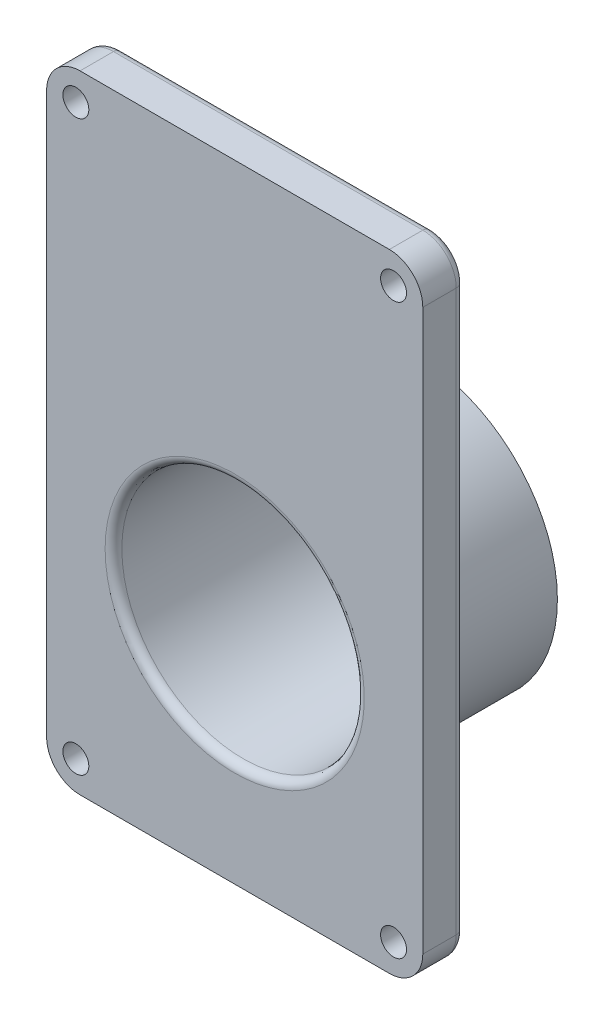
ISO-10303-21;
HEADER;
FILE_DESCRIPTION(('STEP AP214'),'2;1');
FILE_NAME('part.step','',(''),(''),'','','');
FILE_SCHEMA(('AUTOMOTIVE_DESIGN { 1 0 10303 214 1 1 1 1 }'));
ENDSEC;
DATA;
#1=APPLICATION_CONTEXT('core data for automotive mechanical design processes');
#2=APPLICATION_PROTOCOL_DEFINITION('international standard','automotive_design',2000,#1);
#3=PRODUCT_CONTEXT('',#1,'mechanical');
#4=PRODUCT('Part','Part','',(#3));
#5=PRODUCT_RELATED_PRODUCT_CATEGORY('part','',(#4));
#6=PRODUCT_DEFINITION_FORMATION('','',#4);
#7=PRODUCT_DEFINITION_CONTEXT('part definition',#1,'design');
#8=PRODUCT_DEFINITION('design','',#6,#7);
#9=PRODUCT_DEFINITION_SHAPE('','',#8);
#10=(LENGTH_UNIT() NAMED_UNIT(*) SI_UNIT(.MILLI.,.METRE.));
#11=(NAMED_UNIT(*) PLANE_ANGLE_UNIT() SI_UNIT($,.RADIAN.));
#12=(NAMED_UNIT(*) SI_UNIT($,.STERADIAN.) SOLID_ANGLE_UNIT());
#13=UNCERTAINTY_MEASURE_WITH_UNIT(LENGTH_MEASURE(1.E-05),#10,'distance_accuracy_value','');
#14=(GEOMETRIC_REPRESENTATION_CONTEXT(3) GLOBAL_UNCERTAINTY_ASSIGNED_CONTEXT((#13)) GLOBAL_UNIT_ASSIGNED_CONTEXT((#10,
#11,#12)) REPRESENTATION_CONTEXT('',''));
#15=CARTESIAN_POINT('',(0.,0.,0.));
#16=DIRECTION('',(0.,0.,1.));
#17=DIRECTION('',(1.,0.,0.));
#18=AXIS2_PLACEMENT_3D('',#15,#16,#17);
#19=CARTESIAN_POINT('',(0.,0.,5.));
#20=DIRECTION('',(0.,0.,-1.));
#21=DIRECTION('',(-1.,0.,0.));
#22=AXIS2_PLACEMENT_3D('',#19,#20,#21);
#23=PLANE('',#22);
#24=CARTESIAN_POINT('',(0.,-10.5,5.));
#25=DIRECTION('',(0.,0.,-1.));
#26=DIRECTION('',(-1.,0.,0.));
#27=AXIS2_PLACEMENT_3D('',#24,#25,#26);
#28=CIRCLE('',#27,15.5);
#29=CARTESIAN_POINT('',(-15.5,-10.5,5.));
#30=VERTEX_POINT('',#29);
#31=EDGE_CURVE('E46',#30,#30,#28,.T.);
#32=ORIENTED_EDGE('',*,*,#31,.T.);
#33=EDGE_LOOP('',(#32));
#34=FACE_BOUND('',#33,.T.);
#35=CARTESIAN_POINT('',(19.,-34.,5.));
#36=DIRECTION('',(0.,0.,-1.));
#37=DIRECTION('',(-1.,0.,0.));
#38=AXIS2_PLACEMENT_3D('',#35,#36,#37);
#39=CIRCLE('',#38,1.55);
#40=CARTESIAN_POINT('',(17.45,-34.,5.));
#41=VERTEX_POINT('',#40);
#42=EDGE_CURVE('E257',#41,#41,#39,.T.);
#43=ORIENTED_EDGE('',*,*,#42,.T.);
#44=EDGE_LOOP('',(#43));
#45=FACE_BOUND('',#44,.T.);
#46=CARTESIAN_POINT('',(-19.,-34.,5.));
#47=DIRECTION('',(0.,0.,-1.));
#48=DIRECTION('',(-1.,0.,0.));
#49=AXIS2_PLACEMENT_3D('',#46,#47,#48);
#50=CIRCLE('',#49,1.55);
#51=CARTESIAN_POINT('',(-20.55,-34.,5.));
#52=VERTEX_POINT('',#51);
#53=EDGE_CURVE('E253',#52,#52,#50,.F.);
#54=ORIENTED_EDGE('',*,*,#53,.F.);
#55=EDGE_LOOP('',(#54));
#56=FACE_BOUND('',#55,.T.);
#57=DIRECTION('',(0.,-1.,0.));
#58=VECTOR('',#57,1.);
#59=CARTESIAN_POINT('',(-22.5,37.5,5.));
#60=LINE('',#59,#58);
#61=CARTESIAN_POINT('',(-22.5,33.5,5.));
#62=VERTEX_POINT('',#61);
#63=CARTESIAN_POINT('',(-22.5,-33.5,5.));
#64=VERTEX_POINT('',#63);
#65=EDGE_CURVE('E137',#62,#64,#60,.T.);
#66=ORIENTED_EDGE('',*,*,#65,.T.);
#67=CARTESIAN_POINT('',(-18.5,-33.5,5.));
#68=DIRECTION('',(0.,0.,-1.));
#69=DIRECTION('',(-1.,0.,0.));
#70=AXIS2_PLACEMENT_3D('',#67,#68,#69);
#71=CIRCLE('',#70,4.);
#72=CARTESIAN_POINT('',(-18.5,-37.5,5.));
#73=VERTEX_POINT('',#72);
#74=EDGE_CURVE('E131',#64,#73,#71,.F.);
#75=ORIENTED_EDGE('',*,*,#74,.T.);
#76=DIRECTION('',(1.,0.,0.));
#77=VECTOR('',#76,1.);
#78=CARTESIAN_POINT('',(-22.5,-37.5,5.));
#79=LINE('',#78,#77);
#80=CARTESIAN_POINT('',(18.5,-37.5,5.));
#81=VERTEX_POINT('',#80);
#82=EDGE_CURVE('E134',#73,#81,#79,.T.);
#83=ORIENTED_EDGE('',*,*,#82,.T.);
#84=CARTESIAN_POINT('',(18.5,-33.5,5.));
#85=DIRECTION('',(0.,0.,-1.));
#86=DIRECTION('',(-1.,0.,0.));
#87=AXIS2_PLACEMENT_3D('',#84,#85,#86);
#88=CIRCLE('',#87,4.);
#89=CARTESIAN_POINT('',(22.5,-33.5,5.));
#90=VERTEX_POINT('',#89);
#91=EDGE_CURVE('E142',#81,#90,#88,.F.);
#92=ORIENTED_EDGE('',*,*,#91,.T.);
#93=DIRECTION('',(0.,-1.,0.));
#94=VECTOR('',#93,1.);
#95=CARTESIAN_POINT('',(22.5,37.5,5.));
#96=LINE('',#95,#94);
#97=CARTESIAN_POINT('',(22.5,33.5,5.));
#98=VERTEX_POINT('',#97);
#99=EDGE_CURVE('E148',#98,#90,#96,.T.);
#100=ORIENTED_EDGE('',*,*,#99,.F.);
#101=CARTESIAN_POINT('',(18.5,33.5,5.));
#102=DIRECTION('',(0.,0.,-1.));
#103=DIRECTION('',(-1.,0.,0.));
#104=AXIS2_PLACEMENT_3D('',#101,#102,#103);
#105=CIRCLE('',#104,4.);
#106=CARTESIAN_POINT('',(18.5,37.5,5.));
#107=VERTEX_POINT('',#106);
#108=EDGE_CURVE('E165',#98,#107,#105,.F.);
#109=ORIENTED_EDGE('',*,*,#108,.T.);
#110=DIRECTION('',(1.,0.,0.));
#111=VECTOR('',#110,1.);
#112=CARTESIAN_POINT('',(-22.5,37.5,5.));
#113=LINE('',#112,#111);
#114=CARTESIAN_POINT('',(-18.5,37.5,5.));
#115=VERTEX_POINT('',#114);
#116=EDGE_CURVE('E265',#115,#107,#113,.T.);
#117=ORIENTED_EDGE('',*,*,#116,.F.);
#118=CARTESIAN_POINT('',(-18.5,33.5,5.));
#119=DIRECTION('',(0.,0.,-1.));
#120=DIRECTION('',(-1.,0.,0.));
#121=AXIS2_PLACEMENT_3D('',#118,#119,#120);
#122=CIRCLE('',#121,4.);
#123=EDGE_CURVE('E163',#115,#62,#122,.F.);
#124=ORIENTED_EDGE('',*,*,#123,.T.);
#125=EDGE_LOOP('',(#66,#75,#83,#92,#100,#109,#117,#124));
#126=FACE_BOUND('',#125,.T.);
#127=CARTESIAN_POINT('',(19.,34.,5.));
#128=DIRECTION('',(0.,0.,-1.));
#129=DIRECTION('',(-1.,0.,0.));
#130=AXIS2_PLACEMENT_3D('',#127,#128,#129);
#131=CIRCLE('',#130,1.55);
#132=CARTESIAN_POINT('',(17.45,34.,5.));
#133=VERTEX_POINT('',#132);
#134=EDGE_CURVE('E249',#133,#133,#131,.F.);
#135=ORIENTED_EDGE('',*,*,#134,.F.);
#136=EDGE_LOOP('',(#135));
#137=FACE_BOUND('',#136,.T.);
#138=CARTESIAN_POINT('',(-19.,34.,5.));
#139=DIRECTION('',(0.,0.,-1.));
#140=DIRECTION('',(-1.,0.,0.));
#141=AXIS2_PLACEMENT_3D('',#138,#139,#140);
#142=CIRCLE('',#141,1.55);
#143=CARTESIAN_POINT('',(-20.55,34.,5.));
#144=VERTEX_POINT('',#143);
#145=EDGE_CURVE('E149',#144,#144,#142,.T.);
#146=ORIENTED_EDGE('',*,*,#145,.T.);
#147=EDGE_LOOP('',(#146));
#148=FACE_BOUND('',#147,.T.);
#149=ADVANCED_FACE('F37',(#34,#45,#56,#126,#137,#148),#23,.F.);
#150=CARTESIAN_POINT('',(0.,0.,0.));
#151=DIRECTION('',(0.,0.,-1.));
#152=DIRECTION('',(-1.,0.,0.));
#153=AXIS2_PLACEMENT_3D('',#150,#151,#152);
#154=PLANE('',#153);
#155=DIRECTION('',(1.,0.,0.));
#156=VECTOR('',#155,1.);
#157=CARTESIAN_POINT('',(0.,36.5,0.));
#158=LINE('',#157,#156);
#159=CARTESIAN_POINT('',(-18.5,36.5,0.));
#160=VERTEX_POINT('',#159);
#161=CARTESIAN_POINT('',(18.5,36.5,0.));
#162=VERTEX_POINT('',#161);
#163=EDGE_CURVE('E194',#160,#162,#158,.T.);
#164=ORIENTED_EDGE('',*,*,#163,.T.);
#165=CARTESIAN_POINT('',(18.5,33.5,0.));
#166=DIRECTION('',(0.,0.,-1.));
#167=DIRECTION('',(-1.,0.,0.));
#168=AXIS2_PLACEMENT_3D('',#165,#166,#167);
#169=CIRCLE('',#168,3.);
#170=CARTESIAN_POINT('',(21.5,33.5,0.));
#171=VERTEX_POINT('',#170);
#172=EDGE_CURVE('E196',#162,#171,#169,.T.);
#173=ORIENTED_EDGE('',*,*,#172,.T.);
#174=DIRECTION('',(0.,-1.,0.));
#175=VECTOR('',#174,1.);
#176=CARTESIAN_POINT('',(21.5,0.,0.));
#177=LINE('',#176,#175);
#178=CARTESIAN_POINT('',(21.5,-33.5,0.));
#179=VERTEX_POINT('',#178);
#180=EDGE_CURVE('E182',#171,#179,#177,.T.);
#181=ORIENTED_EDGE('',*,*,#180,.T.);
#182=CARTESIAN_POINT('',(18.5,-33.5,0.));
#183=DIRECTION('',(0.,0.,-1.));
#184=DIRECTION('',(-1.,0.,0.));
#185=AXIS2_PLACEMENT_3D('',#182,#183,#184);
#186=CIRCLE('',#185,3.);
#187=CARTESIAN_POINT('',(18.5,-36.5,0.));
#188=VERTEX_POINT('',#187);
#189=EDGE_CURVE('E184',#179,#188,#186,.T.);
#190=ORIENTED_EDGE('',*,*,#189,.T.);
#191=DIRECTION('',(1.,0.,0.));
#192=VECTOR('',#191,1.);
#193=CARTESIAN_POINT('',(-18.5,-36.5,0.));
#194=LINE('',#193,#192);
#195=CARTESIAN_POINT('',(-18.5,-36.5,0.));
#196=VERTEX_POINT('',#195);
#197=EDGE_CURVE('E186',#188,#196,#194,.F.);
#198=ORIENTED_EDGE('',*,*,#197,.T.);
#199=CARTESIAN_POINT('',(-18.5,-33.5,0.));
#200=DIRECTION('',(0.,0.,-1.));
#201=DIRECTION('',(-1.,0.,0.));
#202=AXIS2_PLACEMENT_3D('',#199,#200,#201);
#203=CIRCLE('',#202,3.);
#204=CARTESIAN_POINT('',(-21.5,-33.5,0.));
#205=VERTEX_POINT('',#204);
#206=EDGE_CURVE('E188',#196,#205,#203,.T.);
#207=ORIENTED_EDGE('',*,*,#206,.T.);
#208=DIRECTION('',(0.,-1.,0.));
#209=VECTOR('',#208,1.);
#210=CARTESIAN_POINT('',(-21.5,33.5,0.));
#211=LINE('',#210,#209);
#212=CARTESIAN_POINT('',(-21.5,33.5,0.));
#213=VERTEX_POINT('',#212);
#214=EDGE_CURVE('E190',#205,#213,#211,.F.);
#215=ORIENTED_EDGE('',*,*,#214,.T.);
#216=CARTESIAN_POINT('',(-18.5,33.5,0.));
#217=DIRECTION('',(0.,0.,-1.));
#218=DIRECTION('',(-1.,0.,0.));
#219=AXIS2_PLACEMENT_3D('',#216,#217,#218);
#220=CIRCLE('',#219,3.);
#221=EDGE_CURVE('E192',#213,#160,#220,.T.);
#222=ORIENTED_EDGE('',*,*,#221,.T.);
#223=EDGE_LOOP('',(#164,#173,#181,#190,#198,#207,#215,#222));
#224=FACE_BOUND('',#223,.T.);
#225=CARTESIAN_POINT('',(0.,-10.5,0.));
#226=DIRECTION('',(0.,0.,-1.));
#227=DIRECTION('',(-1.,0.,0.));
#228=AXIS2_PLACEMENT_3D('',#225,#226,#227);
#229=CIRCLE('',#228,18.8);
#230=CARTESIAN_POINT('',(-18.8,-10.5,0.));
#231=VERTEX_POINT('',#230);
#232=EDGE_CURVE('E179',#231,#231,#229,.F.);
#233=ORIENTED_EDGE('',*,*,#232,.T.);
#234=EDGE_LOOP('',(#233));
#235=FACE_BOUND('',#234,.T.);
#236=CARTESIAN_POINT('',(-19.,-34.,0.));
#237=DIRECTION('',(0.,0.,-1.));
#238=DIRECTION('',(-1.,0.,0.));
#239=AXIS2_PLACEMENT_3D('',#236,#237,#238);
#240=CIRCLE('',#239,1.55);
#241=CARTESIAN_POINT('',(-20.55,-34.,0.));
#242=VERTEX_POINT('',#241);
#243=EDGE_CURVE('E252',#242,#242,#240,.F.);
#244=ORIENTED_EDGE('',*,*,#243,.T.);
#245=EDGE_LOOP('',(#244));
#246=FACE_BOUND('',#245,.T.);
#247=CARTESIAN_POINT('',(19.,34.,0.));
#248=DIRECTION('',(0.,0.,-1.));
#249=DIRECTION('',(-1.,0.,0.));
#250=AXIS2_PLACEMENT_3D('',#247,#248,#249);
#251=CIRCLE('',#250,1.55);
#252=CARTESIAN_POINT('',(17.45,34.,0.));
#253=VERTEX_POINT('',#252);
#254=EDGE_CURVE('E246',#253,#253,#251,.F.);
#255=ORIENTED_EDGE('',*,*,#254,.T.);
#256=EDGE_LOOP('',(#255));
#257=FACE_BOUND('',#256,.T.);
#258=CARTESIAN_POINT('',(19.,-34.,0.));
#259=DIRECTION('',(0.,0.,-1.));
#260=DIRECTION('',(-1.,0.,0.));
#261=AXIS2_PLACEMENT_3D('',#258,#259,#260);
#262=CIRCLE('',#261,1.55);
#263=CARTESIAN_POINT('',(17.45,-34.,0.));
#264=VERTEX_POINT('',#263);
#265=EDGE_CURVE('E256',#264,#264,#262,.T.);
#266=ORIENTED_EDGE('',*,*,#265,.F.);
#267=EDGE_LOOP('',(#266));
#268=FACE_BOUND('',#267,.T.);
#269=CARTESIAN_POINT('',(-19.,34.,0.));
#270=DIRECTION('',(0.,0.,-1.));
#271=DIRECTION('',(-1.,0.,0.));
#272=AXIS2_PLACEMENT_3D('',#269,#270,#271);
#273=CIRCLE('',#272,1.55);
#274=CARTESIAN_POINT('',(-20.55,34.,0.));
#275=VERTEX_POINT('',#274);
#276=EDGE_CURVE('E260',#275,#275,#273,.T.);
#277=ORIENTED_EDGE('',*,*,#276,.F.);
#278=EDGE_LOOP('',(#277));
#279=FACE_BOUND('',#278,.T.);
#280=ADVANCED_FACE('F280',(#224,#235,#246,#257,#268,#279),#154,.T.);
#281=CARTESIAN_POINT('',(-22.5,-37.5,5.));
#282=DIRECTION('',(0.,1.,0.));
#283=DIRECTION('',(0.,0.,1.));
#284=AXIS2_PLACEMENT_3D('',#281,#282,#283);
#285=PLANE('',#284);
#286=DIRECTION('',(0.,0.,-1.));
#287=VECTOR('',#286,1.);
#288=CARTESIAN_POINT('',(-18.5,-37.5,5.));
#289=LINE('',#288,#287);
#290=CARTESIAN_POINT('',(-18.5,-37.5,1.));
#291=VERTEX_POINT('',#290);
#292=EDGE_CURVE('E145',#73,#291,#289,.T.);
#293=ORIENTED_EDGE('',*,*,#292,.T.);
#294=DIRECTION('',(1.,0.,0.));
#295=VECTOR('',#294,1.);
#296=CARTESIAN_POINT('',(18.5,-37.5,1.));
#297=LINE('',#296,#295);
#298=CARTESIAN_POINT('',(18.5,-37.5,1.));
#299=VERTEX_POINT('',#298);
#300=EDGE_CURVE('E62',#291,#299,#297,.T.);
#301=ORIENTED_EDGE('',*,*,#300,.T.);
#302=DIRECTION('',(0.,0.,-1.));
#303=VECTOR('',#302,1.);
#304=CARTESIAN_POINT('',(18.5,-37.5,5.));
#305=LINE('',#304,#303);
#306=EDGE_CURVE('E147',#299,#81,#305,.F.);
#307=ORIENTED_EDGE('',*,*,#306,.T.);
#308=ORIENTED_EDGE('',*,*,#82,.F.);
#309=EDGE_LOOP('',(#293,#301,#307,#308));
#310=FACE_BOUND('',#309,.T.);
#311=ADVANCED_FACE('F144',(#310),#285,.F.);
#312=CARTESIAN_POINT('',(22.5,37.5,5.));
#313=DIRECTION('',(1.,0.,0.));
#314=DIRECTION('',(0.,1.,0.));
#315=AXIS2_PLACEMENT_3D('',#312,#313,#314);
#316=PLANE('',#315);
#317=DIRECTION('',(0.,0.,-1.));
#318=VECTOR('',#317,1.);
#319=CARTESIAN_POINT('',(22.5,-33.5,0.));
#320=LINE('',#319,#318);
#321=CARTESIAN_POINT('',(22.5,-33.5,1.));
#322=VERTEX_POINT('',#321);
#323=EDGE_CURVE('E169',#90,#322,#320,.T.);
#324=ORIENTED_EDGE('',*,*,#323,.T.);
#325=DIRECTION('',(0.,-1.,0.));
#326=VECTOR('',#325,1.);
#327=CARTESIAN_POINT('',(22.5,37.5,1.));
#328=LINE('',#327,#326);
#329=CARTESIAN_POINT('',(22.5,33.5,1.));
#330=VERTEX_POINT('',#329);
#331=EDGE_CURVE('E211',#322,#330,#328,.F.);
#332=ORIENTED_EDGE('',*,*,#331,.T.);
#333=DIRECTION('',(0.,0.,-1.));
#334=VECTOR('',#333,1.);
#335=CARTESIAN_POINT('',(22.5,33.5,5.));
#336=LINE('',#335,#334);
#337=EDGE_CURVE('E141',#330,#98,#336,.F.);
#338=ORIENTED_EDGE('',*,*,#337,.T.);
#339=ORIENTED_EDGE('',*,*,#99,.T.);
#340=EDGE_LOOP('',(#324,#332,#338,#339));
#341=FACE_BOUND('',#340,.T.);
#342=ADVANCED_FACE('F288',(#341),#316,.T.);
#343=CARTESIAN_POINT('',(-22.5,37.5,5.));
#344=DIRECTION('',(0.,1.,0.));
#345=DIRECTION('',(0.,0.,1.));
#346=AXIS2_PLACEMENT_3D('',#343,#344,#345);
#347=PLANE('',#346);
#348=DIRECTION('',(0.,0.,-1.));
#349=VECTOR('',#348,1.);
#350=CARTESIAN_POINT('',(18.5,37.5,5.));
#351=LINE('',#350,#349);
#352=CARTESIAN_POINT('',(18.5,37.5,1.));
#353=VERTEX_POINT('',#352);
#354=EDGE_CURVE('E173',#107,#353,#351,.T.);
#355=ORIENTED_EDGE('',*,*,#354,.T.);
#356=DIRECTION('',(1.,0.,0.));
#357=VECTOR('',#356,1.);
#358=CARTESIAN_POINT('',(-22.5,37.5,1.));
#359=LINE('',#358,#357);
#360=CARTESIAN_POINT('',(-18.5,37.5,1.));
#361=VERTEX_POINT('',#360);
#362=EDGE_CURVE('E202',#353,#361,#359,.F.);
#363=ORIENTED_EDGE('',*,*,#362,.T.);
#364=DIRECTION('',(0.,0.,-1.));
#365=VECTOR('',#364,1.);
#366=CARTESIAN_POINT('',(-18.5,37.5,5.));
#367=LINE('',#366,#365);
#368=EDGE_CURVE('E171',#361,#115,#367,.F.);
#369=ORIENTED_EDGE('',*,*,#368,.T.);
#370=ORIENTED_EDGE('',*,*,#116,.T.);
#371=EDGE_LOOP('',(#355,#363,#369,#370));
#372=FACE_BOUND('',#371,.T.);
#373=ADVANCED_FACE('F299',(#372),#347,.T.);
#374=CARTESIAN_POINT('',(-22.5,37.5,5.));
#375=DIRECTION('',(1.,0.,0.));
#376=DIRECTION('',(0.,1.,0.));
#377=AXIS2_PLACEMENT_3D('',#374,#375,#376);
#378=PLANE('',#377);
#379=DIRECTION('',(0.,0.,-1.));
#380=VECTOR('',#379,1.);
#381=CARTESIAN_POINT('',(-22.5,33.5,0.));
#382=LINE('',#381,#380);
#383=CARTESIAN_POINT('',(-22.5,33.5,1.));
#384=VERTEX_POINT('',#383);
#385=EDGE_CURVE('E154',#62,#384,#382,.T.);
#386=ORIENTED_EDGE('',*,*,#385,.T.);
#387=DIRECTION('',(0.,-1.,0.));
#388=VECTOR('',#387,1.);
#389=CARTESIAN_POINT('',(-22.5,-33.5,1.));
#390=LINE('',#389,#388);
#391=CARTESIAN_POINT('',(-22.5,-33.5,1.));
#392=VERTEX_POINT('',#391);
#393=EDGE_CURVE('E206',#384,#392,#390,.T.);
#394=ORIENTED_EDGE('',*,*,#393,.T.);
#395=DIRECTION('',(0.,0.,-1.));
#396=VECTOR('',#395,1.);
#397=CARTESIAN_POINT('',(-22.5,-33.5,5.));
#398=LINE('',#397,#396);
#399=EDGE_CURVE('E157',#392,#64,#398,.F.);
#400=ORIENTED_EDGE('',*,*,#399,.T.);
#401=ORIENTED_EDGE('',*,*,#65,.F.);
#402=EDGE_LOOP('',(#386,#394,#400,#401));
#403=FACE_BOUND('',#402,.T.);
#404=ADVANCED_FACE('F295',(#403),#378,.F.);
#405=CARTESIAN_POINT('',(19.,34.,-22.5));
#406=DIRECTION('',(0.,0.,1.));
#407=DIRECTION('',(1.,0.,0.));
#408=AXIS2_PLACEMENT_3D('',#405,#406,#407);
#409=CYLINDRICAL_SURFACE('',#408,1.55);
#410=ORIENTED_EDGE('',*,*,#254,.F.);
#411=EDGE_LOOP('',(#410));
#412=FACE_BOUND('',#411,.T.);
#413=ORIENTED_EDGE('',*,*,#134,.T.);
#414=EDGE_LOOP('',(#413));
#415=FACE_BOUND('',#414,.T.);
#416=ADVANCED_FACE('F298',(#412,#415),#409,.F.);
#417=CARTESIAN_POINT('',(0.,-10.5,-22.5));
#418=DIRECTION('',(0.,0.,1.));
#419=DIRECTION('',(1.,0.,0.));
#420=AXIS2_PLACEMENT_3D('',#417,#418,#419);
#421=CYLINDRICAL_SURFACE('',#420,14.5);
#422=CARTESIAN_POINT('',(0.,-10.5,4.));
#423=DIRECTION('',(0.,0.,-1.));
#424=DIRECTION('',(-1.,0.,0.));
#425=AXIS2_PLACEMENT_3D('',#422,#423,#424);
#426=CIRCLE('',#425,14.5);
#427=CARTESIAN_POINT('',(-14.5,-10.5,4.));
#428=VERTEX_POINT('',#427);
#429=EDGE_CURVE('E11',#428,#428,#426,.F.);
#430=ORIENTED_EDGE('',*,*,#429,.T.);
#431=EDGE_LOOP('',(#430));
#432=FACE_BOUND('',#431,.T.);
#433=CARTESIAN_POINT('',(0.,-10.5,-16.8));
#434=DIRECTION('',(0.,0.,-1.));
#435=DIRECTION('',(-1.,0.,0.));
#436=AXIS2_PLACEMENT_3D('',#433,#434,#435);
#437=CIRCLE('',#436,14.5);
#438=CARTESIAN_POINT('',(-14.5,-10.5,-16.8));
#439=VERTEX_POINT('',#438);
#440=EDGE_CURVE('E235',#439,#439,#437,.F.);
#441=ORIENTED_EDGE('',*,*,#440,.F.);
#442=EDGE_LOOP('',(#441));
#443=FACE_BOUND('',#442,.T.);
#444=ADVANCED_FACE('F459',(#432,#443),#421,.F.);
#445=CARTESIAN_POINT('',(-19.,-34.,-22.5));
#446=DIRECTION('',(0.,0.,1.));
#447=DIRECTION('',(1.,0.,0.));
#448=AXIS2_PLACEMENT_3D('',#445,#446,#447);
#449=CYLINDRICAL_SURFACE('',#448,1.55);
#450=ORIENTED_EDGE('',*,*,#243,.F.);
#451=EDGE_LOOP('',(#450));
#452=FACE_BOUND('',#451,.T.);
#453=ORIENTED_EDGE('',*,*,#53,.T.);
#454=EDGE_LOOP('',(#453));
#455=FACE_BOUND('',#454,.T.);
#456=ADVANCED_FACE('F465',(#452,#455),#449,.F.);
#457=CARTESIAN_POINT('',(19.,-34.,-22.5));
#458=DIRECTION('',(0.,0.,1.));
#459=DIRECTION('',(1.,0.,0.));
#460=AXIS2_PLACEMENT_3D('',#457,#458,#459);
#461=CYLINDRICAL_SURFACE('',#460,1.55);
#462=ORIENTED_EDGE('',*,*,#265,.T.);
#463=EDGE_LOOP('',(#462));
#464=FACE_BOUND('',#463,.T.);
#465=ORIENTED_EDGE('',*,*,#42,.F.);
#466=EDGE_LOOP('',(#465));
#467=FACE_BOUND('',#466,.T.);
#468=ADVANCED_FACE('F508',(#464,#467),#461,.F.);
#469=CARTESIAN_POINT('',(-19.,34.,-22.5));
#470=DIRECTION('',(0.,0.,1.));
#471=DIRECTION('',(1.,0.,0.));
#472=AXIS2_PLACEMENT_3D('',#469,#470,#471);
#473=CYLINDRICAL_SURFACE('',#472,1.55);
#474=ORIENTED_EDGE('',*,*,#276,.T.);
#475=EDGE_LOOP('',(#474));
#476=FACE_BOUND('',#475,.T.);
#477=ORIENTED_EDGE('',*,*,#145,.F.);
#478=EDGE_LOOP('',(#477));
#479=FACE_BOUND('',#478,.T.);
#480=ADVANCED_FACE('F277',(#476,#479),#473,.F.);
#481=CARTESIAN_POINT('',(-18.5,-33.5,5.));
#482=DIRECTION('',(0.,0.,-1.));
#483=DIRECTION('',(-1.,0.,0.));
#484=AXIS2_PLACEMENT_3D('',#481,#482,#483);
#485=CYLINDRICAL_SURFACE('',#484,4.);
#486=ORIENTED_EDGE('',*,*,#399,.F.);
#487=CARTESIAN_POINT('',(-18.5,-33.5,1.));
#488=DIRECTION('',(0.,0.,-1.));
#489=DIRECTION('',(-1.,0.,0.));
#490=AXIS2_PLACEMENT_3D('',#487,#488,#489);
#491=CIRCLE('',#490,4.);
#492=EDGE_CURVE('E153',#392,#291,#491,.F.);
#493=ORIENTED_EDGE('',*,*,#492,.T.);
#494=ORIENTED_EDGE('',*,*,#292,.F.);
#495=ORIENTED_EDGE('',*,*,#74,.F.);
#496=EDGE_LOOP('',(#486,#493,#494,#495));
#497=FACE_BOUND('',#496,.T.);
#498=ADVANCED_FACE('F151',(#497),#485,.T.);
#499=CARTESIAN_POINT('',(18.5,-33.5,5.));
#500=DIRECTION('',(0.,0.,1.));
#501=DIRECTION('',(1.,0.,0.));
#502=AXIS2_PLACEMENT_3D('',#499,#500,#501);
#503=CYLINDRICAL_SURFACE('',#502,4.);
#504=ORIENTED_EDGE('',*,*,#306,.F.);
#505=CARTESIAN_POINT('',(18.5,-33.5,1.));
#506=DIRECTION('',(0.,0.,-1.));
#507=DIRECTION('',(-1.,0.,0.));
#508=AXIS2_PLACEMENT_3D('',#505,#506,#507);
#509=CIRCLE('',#508,4.);
#510=EDGE_CURVE('E54',#299,#322,#509,.F.);
#511=ORIENTED_EDGE('',*,*,#510,.T.);
#512=ORIENTED_EDGE('',*,*,#323,.F.);
#513=ORIENTED_EDGE('',*,*,#91,.F.);
#514=EDGE_LOOP('',(#504,#511,#512,#513));
#515=FACE_BOUND('',#514,.T.);
#516=ADVANCED_FACE('F309',(#515),#503,.T.);
#517=CARTESIAN_POINT('',(18.5,33.5,5.));
#518=DIRECTION('',(0.,0.,-1.));
#519=DIRECTION('',(-1.,0.,0.));
#520=AXIS2_PLACEMENT_3D('',#517,#518,#519);
#521=CYLINDRICAL_SURFACE('',#520,4.);
#522=ORIENTED_EDGE('',*,*,#337,.F.);
#523=CARTESIAN_POINT('',(18.5,33.5,1.));
#524=DIRECTION('',(0.,0.,-1.));
#525=DIRECTION('',(-1.,0.,0.));
#526=AXIS2_PLACEMENT_3D('',#523,#524,#525);
#527=CIRCLE('',#526,4.);
#528=EDGE_CURVE('E199',#330,#353,#527,.F.);
#529=ORIENTED_EDGE('',*,*,#528,.T.);
#530=ORIENTED_EDGE('',*,*,#354,.F.);
#531=ORIENTED_EDGE('',*,*,#108,.F.);
#532=EDGE_LOOP('',(#522,#529,#530,#531));
#533=FACE_BOUND('',#532,.T.);
#534=ADVANCED_FACE('F312',(#533),#521,.T.);
#535=CARTESIAN_POINT('',(-18.5,33.5,5.));
#536=DIRECTION('',(0.,0.,1.));
#537=DIRECTION('',(1.,0.,0.));
#538=AXIS2_PLACEMENT_3D('',#535,#536,#537);
#539=CYLINDRICAL_SURFACE('',#538,4.);
#540=ORIENTED_EDGE('',*,*,#368,.F.);
#541=CARTESIAN_POINT('',(-18.5,33.5,1.));
#542=DIRECTION('',(0.,0.,-1.));
#543=DIRECTION('',(-1.,0.,0.));
#544=AXIS2_PLACEMENT_3D('',#541,#542,#543);
#545=CIRCLE('',#544,4.);
#546=EDGE_CURVE('E204',#361,#384,#545,.F.);
#547=ORIENTED_EDGE('',*,*,#546,.T.);
#548=ORIENTED_EDGE('',*,*,#385,.F.);
#549=ORIENTED_EDGE('',*,*,#123,.F.);
#550=EDGE_LOOP('',(#540,#547,#548,#549));
#551=FACE_BOUND('',#550,.T.);
#552=ADVANCED_FACE('F315',(#551),#539,.T.);
#553=CARTESIAN_POINT('',(0.,-10.5,-16.8));
#554=DIRECTION('',(0.,0.,1.));
#555=DIRECTION('',(1.,0.,0.));
#556=AXIS2_PLACEMENT_3D('',#553,#554,#555);
#557=CYLINDRICAL_SURFACE('',#556,16.8);
#558=CARTESIAN_POINT('',(0.,-10.5,-2.));
#559=DIRECTION('',(0.,0.,-1.));
#560=DIRECTION('',(-1.,0.,0.));
#561=AXIS2_PLACEMENT_3D('',#558,#559,#560);
#562=CIRCLE('',#561,16.8);
#563=CARTESIAN_POINT('',(-16.8,-10.5,-2.));
#564=VERTEX_POINT('',#563);
#565=EDGE_CURVE('E176',#564,#564,#562,.T.);
#566=ORIENTED_EDGE('',*,*,#565,.T.);
#567=EDGE_LOOP('',(#566));
#568=FACE_BOUND('',#567,.T.);
#569=CARTESIAN_POINT('',(0.,-10.5,-16.8));
#570=DIRECTION('',(0.,0.,-1.));
#571=DIRECTION('',(-1.,0.,0.));
#572=AXIS2_PLACEMENT_3D('',#569,#570,#571);
#573=CIRCLE('',#572,16.8);
#574=CARTESIAN_POINT('',(-16.8,-10.5,-16.8));
#575=VERTEX_POINT('',#574);
#576=EDGE_CURVE('E241',#575,#575,#573,.T.);
#577=ORIENTED_EDGE('',*,*,#576,.F.);
#578=EDGE_LOOP('',(#577));
#579=FACE_BOUND('',#578,.T.);
#580=ADVANCED_FACE('F319',(#568,#579),#557,.T.);
#581=CARTESIAN_POINT('',(0.,0.,-16.8));
#582=DIRECTION('',(0.,0.,-1.));
#583=DIRECTION('',(-1.,0.,0.));
#584=AXIS2_PLACEMENT_3D('',#581,#582,#583);
#585=PLANE('',#584);
#586=ORIENTED_EDGE('',*,*,#440,.T.);
#587=EDGE_LOOP('',(#586));
#588=FACE_BOUND('',#587,.T.);
#589=ORIENTED_EDGE('',*,*,#576,.T.);
#590=EDGE_LOOP('',(#589));
#591=FACE_BOUND('',#590,.T.);
#592=ADVANCED_FACE('F325',(#588,#591),#585,.T.);
#593=CARTESIAN_POINT('',(0.,-10.5,-2.));
#594=DIRECTION('',(0.,0.,-1.));
#595=DIRECTION('',(-1.,0.,0.));
#596=AXIS2_PLACEMENT_3D('',#593,#594,#595);
#597=TOROIDAL_SURFACE('',#596,18.8,2.);
#598=ORIENTED_EDGE('',*,*,#232,.F.);
#599=EDGE_LOOP('',(#598));
#600=FACE_BOUND('',#599,.T.);
#601=ORIENTED_EDGE('',*,*,#565,.F.);
#602=EDGE_LOOP('',(#601));
#603=FACE_BOUND('',#602,.T.);
#604=ADVANCED_FACE('F321',(#600,#603),#597,.F.);
#605=CARTESIAN_POINT('',(-18.5,-33.5,1.));
#606=DIRECTION('',(0.,0.,-1.));
#607=DIRECTION('',(-1.,0.,0.));
#608=AXIS2_PLACEMENT_3D('',#605,#606,#607);
#609=TOROIDAL_SURFACE('',#608,3.,1.);
#610=CARTESIAN_POINT('',(-18.5,-36.5,1.));
#611=DIRECTION('',(1.,0.,0.));
#612=DIRECTION('',(0.,0.,-1.));
#613=AXIS2_PLACEMENT_3D('',#610,#611,#612);
#614=CIRCLE('',#613,1.);
#615=EDGE_CURVE('E230',#291,#196,#614,.T.);
#616=ORIENTED_EDGE('',*,*,#615,.F.);
#617=ORIENTED_EDGE('',*,*,#492,.F.);
#618=CARTESIAN_POINT('',(-21.5,-33.5,1.));
#619=DIRECTION('',(0.,1.,0.));
#620=DIRECTION('',(0.,0.,1.));
#621=AXIS2_PLACEMENT_3D('',#618,#619,#620);
#622=CIRCLE('',#621,1.);
#623=EDGE_CURVE('E41',#205,#392,#622,.T.);
#624=ORIENTED_EDGE('',*,*,#623,.F.);
#625=ORIENTED_EDGE('',*,*,#206,.F.);
#626=EDGE_LOOP('',(#616,#617,#624,#625));
#627=FACE_BOUND('',#626,.T.);
#628=ADVANCED_FACE('F324',(#627),#609,.T.);
#629=CARTESIAN_POINT('',(-21.5,37.5,1.));
#630=DIRECTION('',(0.,1.,0.));
#631=DIRECTION('',(-1.,0.,0.));
#632=AXIS2_PLACEMENT_3D('',#629,#630,#631);
#633=CYLINDRICAL_SURFACE('',#632,1.);
#634=ORIENTED_EDGE('',*,*,#623,.T.);
#635=ORIENTED_EDGE('',*,*,#393,.F.);
#636=CARTESIAN_POINT('',(-21.5,33.5,1.));
#637=DIRECTION('',(0.,1.,0.));
#638=DIRECTION('',(0.,0.,1.));
#639=AXIS2_PLACEMENT_3D('',#636,#637,#638);
#640=CIRCLE('',#639,1.);
#641=EDGE_CURVE('E228',#213,#384,#640,.T.);
#642=ORIENTED_EDGE('',*,*,#641,.F.);
#643=ORIENTED_EDGE('',*,*,#214,.F.);
#644=EDGE_LOOP('',(#634,#635,#642,#643));
#645=FACE_BOUND('',#644,.T.);
#646=ADVANCED_FACE('F350',(#645),#633,.T.);
#647=CARTESIAN_POINT('',(-22.5,-36.5,1.));
#648=DIRECTION('',(-1.,0.,0.));
#649=DIRECTION('',(0.,0.,1.));
#650=AXIS2_PLACEMENT_3D('',#647,#648,#649);
#651=CYLINDRICAL_SURFACE('',#650,1.);
#652=ORIENTED_EDGE('',*,*,#615,.T.);
#653=ORIENTED_EDGE('',*,*,#197,.F.);
#654=CARTESIAN_POINT('',(18.5,-36.5,1.));
#655=DIRECTION('',(1.,0.,0.));
#656=DIRECTION('',(0.,0.,-1.));
#657=AXIS2_PLACEMENT_3D('',#654,#655,#656);
#658=CIRCLE('',#657,1.);
#659=EDGE_CURVE('E225',#299,#188,#658,.T.);
#660=ORIENTED_EDGE('',*,*,#659,.F.);
#661=ORIENTED_EDGE('',*,*,#300,.F.);
#662=EDGE_LOOP('',(#652,#653,#660,#661));
#663=FACE_BOUND('',#662,.T.);
#664=ADVANCED_FACE('F346',(#663),#651,.T.);
#665=CARTESIAN_POINT('',(-18.5,33.5,1.));
#666=DIRECTION('',(0.,0.,-1.));
#667=DIRECTION('',(-1.,0.,0.));
#668=AXIS2_PLACEMENT_3D('',#665,#666,#667);
#669=TOROIDAL_SURFACE('',#668,3.,1.);
#670=ORIENTED_EDGE('',*,*,#641,.T.);
#671=ORIENTED_EDGE('',*,*,#546,.F.);
#672=CARTESIAN_POINT('',(-18.5,36.5,1.));
#673=DIRECTION('',(1.,0.,0.));
#674=DIRECTION('',(0.,0.,-1.));
#675=AXIS2_PLACEMENT_3D('',#672,#673,#674);
#676=CIRCLE('',#675,1.);
#677=EDGE_CURVE('E222',#160,#361,#676,.T.);
#678=ORIENTED_EDGE('',*,*,#677,.F.);
#679=ORIENTED_EDGE('',*,*,#221,.F.);
#680=EDGE_LOOP('',(#670,#671,#678,#679));
#681=FACE_BOUND('',#680,.T.);
#682=ADVANCED_FACE('F342',(#681),#669,.T.);
#683=CARTESIAN_POINT('',(18.5,-33.5,1.));
#684=DIRECTION('',(0.,0.,-1.));
#685=DIRECTION('',(-1.,0.,0.));
#686=AXIS2_PLACEMENT_3D('',#683,#684,#685);
#687=TOROIDAL_SURFACE('',#686,3.,1.);
#688=ORIENTED_EDGE('',*,*,#659,.T.);
#689=ORIENTED_EDGE('',*,*,#189,.F.);
#690=CARTESIAN_POINT('',(21.5,-33.5,1.));
#691=DIRECTION('',(0.,1.,0.));
#692=DIRECTION('',(0.,0.,1.));
#693=AXIS2_PLACEMENT_3D('',#690,#691,#692);
#694=CIRCLE('',#693,1.);
#695=EDGE_CURVE('E219',#322,#179,#694,.T.);
#696=ORIENTED_EDGE('',*,*,#695,.F.);
#697=ORIENTED_EDGE('',*,*,#510,.F.);
#698=EDGE_LOOP('',(#688,#689,#696,#697));
#699=FACE_BOUND('',#698,.T.);
#700=ADVANCED_FACE('F338',(#699),#687,.T.);
#701=CARTESIAN_POINT('',(0.,36.5,1.));
#702=DIRECTION('',(1.,0.,0.));
#703=DIRECTION('',(0.,0.,-1.));
#704=AXIS2_PLACEMENT_3D('',#701,#702,#703);
#705=CYLINDRICAL_SURFACE('',#704,1.);
#706=ORIENTED_EDGE('',*,*,#677,.T.);
#707=ORIENTED_EDGE('',*,*,#362,.F.);
#708=CARTESIAN_POINT('',(18.5,36.5,1.));
#709=DIRECTION('',(1.,0.,0.));
#710=DIRECTION('',(0.,0.,-1.));
#711=AXIS2_PLACEMENT_3D('',#708,#709,#710);
#712=CIRCLE('',#711,1.);
#713=EDGE_CURVE('E217',#162,#353,#712,.T.);
#714=ORIENTED_EDGE('',*,*,#713,.F.);
#715=ORIENTED_EDGE('',*,*,#163,.F.);
#716=EDGE_LOOP('',(#706,#707,#714,#715));
#717=FACE_BOUND('',#716,.T.);
#718=ADVANCED_FACE('F334',(#717),#705,.T.);
#719=CARTESIAN_POINT('',(21.5,0.,1.));
#720=DIRECTION('',(0.,-1.,0.));
#721=DIRECTION('',(1.,0.,0.));
#722=AXIS2_PLACEMENT_3D('',#719,#720,#721);
#723=CYLINDRICAL_SURFACE('',#722,1.);
#724=ORIENTED_EDGE('',*,*,#695,.T.);
#725=ORIENTED_EDGE('',*,*,#180,.F.);
#726=CARTESIAN_POINT('',(21.5,33.5,1.));
#727=DIRECTION('',(0.,1.,0.));
#728=DIRECTION('',(0.,0.,1.));
#729=AXIS2_PLACEMENT_3D('',#726,#727,#728);
#730=CIRCLE('',#729,1.);
#731=EDGE_CURVE('E215',#330,#171,#730,.T.);
#732=ORIENTED_EDGE('',*,*,#731,.F.);
#733=ORIENTED_EDGE('',*,*,#331,.F.);
#734=EDGE_LOOP('',(#724,#725,#732,#733));
#735=FACE_BOUND('',#734,.T.);
#736=ADVANCED_FACE('F330',(#735),#723,.T.);
#737=CARTESIAN_POINT('',(18.5,33.5,1.));
#738=DIRECTION('',(0.,0.,-1.));
#739=DIRECTION('',(-1.,0.,0.));
#740=AXIS2_PLACEMENT_3D('',#737,#738,#739);
#741=TOROIDAL_SURFACE('',#740,3.,1.);
#742=ORIENTED_EDGE('',*,*,#713,.T.);
#743=ORIENTED_EDGE('',*,*,#528,.F.);
#744=ORIENTED_EDGE('',*,*,#731,.T.);
#745=ORIENTED_EDGE('',*,*,#172,.F.);
#746=EDGE_LOOP('',(#742,#743,#744,#745));
#747=FACE_BOUND('',#746,.T.);
#748=ADVANCED_FACE('F327',(#747),#741,.T.);
#749=CARTESIAN_POINT('',(0.,-10.5,4.));
#750=DIRECTION('',(0.,0.,-1.));
#751=DIRECTION('',(-1.,0.,0.));
#752=AXIS2_PLACEMENT_3D('',#749,#750,#751);
#753=TOROIDAL_SURFACE('',#752,15.5,1.);
#754=ORIENTED_EDGE('',*,*,#429,.F.);
#755=EDGE_LOOP('',(#754));
#756=FACE_BOUND('',#755,.T.);
#757=ORIENTED_EDGE('',*,*,#31,.F.);
#758=EDGE_LOOP('',(#757));
#759=FACE_BOUND('',#758,.T.);
#760=ADVANCED_FACE('F39',(#756,#759),#753,.T.);
#761=CLOSED_SHELL('',(#149,#280,#311,#342,#373,#404,#416,#444,#456,#468,#480,#498,#516,#534,
#552,#580,#592,#604,#628,#646,#664,#682,#700,#718,#736,#748,#760));
#762=MANIFOLD_SOLID_BREP('B2',#761);
#763=ADVANCED_BREP_SHAPE_REPRESENTATION('',(#18,#762),#14);
#764=SHAPE_DEFINITION_REPRESENTATION(#9,#763);
ENDSEC;
END-ISO-10303-21;
